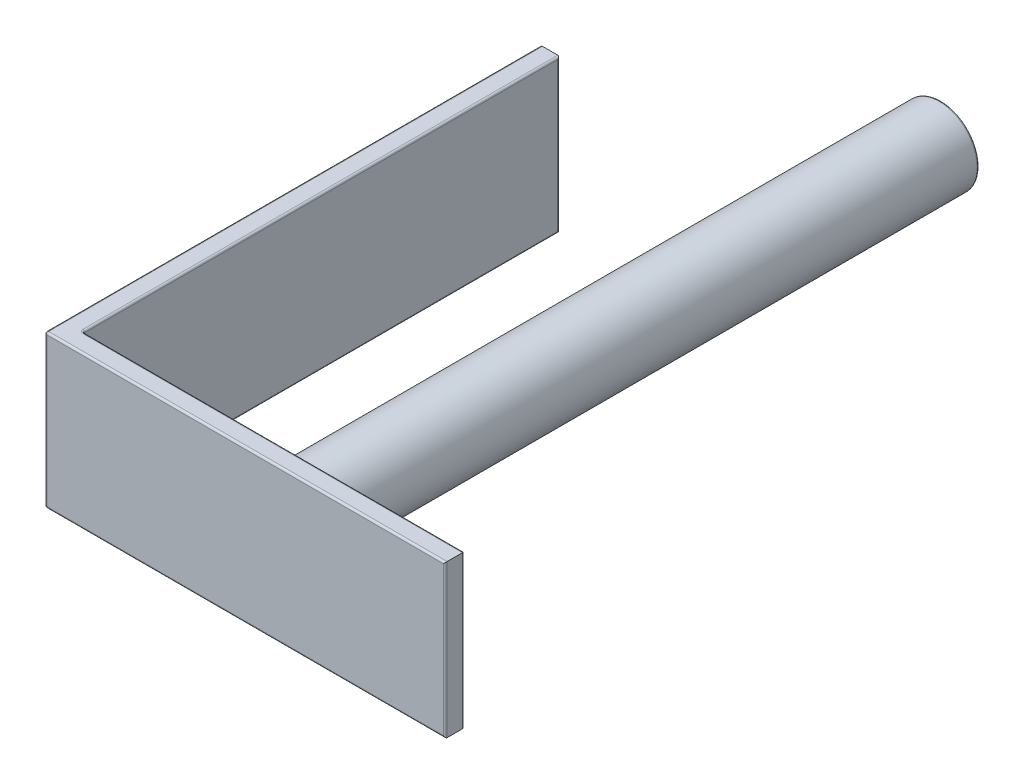
ISO-10303-21;
HEADER;
FILE_DESCRIPTION(('STEP AP214'),'2;1');
FILE_NAME('part.step','',(''),(''),'','','');
FILE_SCHEMA(('AUTOMOTIVE_DESIGN { 1 0 10303 214 1 1 1 1 }'));
ENDSEC;
DATA;
#1=APPLICATION_CONTEXT('core data for automotive mechanical design processes');
#2=APPLICATION_PROTOCOL_DEFINITION('international standard','automotive_design',2000,#1);
#3=PRODUCT_CONTEXT('',#1,'mechanical');
#4=PRODUCT('Part','Part','',(#3));
#5=PRODUCT_RELATED_PRODUCT_CATEGORY('part','',(#4));
#6=PRODUCT_DEFINITION_FORMATION('','',#4);
#7=PRODUCT_DEFINITION_CONTEXT('part definition',#1,'design');
#8=PRODUCT_DEFINITION('design','',#6,#7);
#9=PRODUCT_DEFINITION_SHAPE('','',#8);
#10=(LENGTH_UNIT() NAMED_UNIT(*) SI_UNIT(.MILLI.,.METRE.));
#11=(NAMED_UNIT(*) PLANE_ANGLE_UNIT() SI_UNIT($,.RADIAN.));
#12=(NAMED_UNIT(*) SI_UNIT($,.STERADIAN.) SOLID_ANGLE_UNIT());
#13=UNCERTAINTY_MEASURE_WITH_UNIT(LENGTH_MEASURE(1.E-05),#10,'distance_accuracy_value','');
#14=(GEOMETRIC_REPRESENTATION_CONTEXT(3) GLOBAL_UNCERTAINTY_ASSIGNED_CONTEXT((#13)) GLOBAL_UNIT_ASSIGNED_CONTEXT((#10,
#11,#12)) REPRESENTATION_CONTEXT('',''));
#15=CARTESIAN_POINT('',(0.,0.,0.));
#16=DIRECTION('',(0.,0.,1.));
#17=DIRECTION('',(1.,0.,0.));
#18=AXIS2_PLACEMENT_3D('',#15,#16,#17);
#19=CARTESIAN_POINT('',(0.,0.,-889.));
#20=DIRECTION('',(0.,0.,1.));
#21=DIRECTION('',(1.,0.,0.));
#22=AXIS2_PLACEMENT_3D('',#19,#20,#21);
#23=CYLINDRICAL_SURFACE('',#22,50.8);
#24=CARTESIAN_POINT('',(0.,0.,-2.53999999999999));
#25=DIRECTION('',(0.,0.,1.));
#26=DIRECTION('',(1.,0.,0.));
#27=AXIS2_PLACEMENT_3D('',#24,#25,#26);
#28=CIRCLE('',#27,50.8);
#29=CARTESIAN_POINT('',(50.8,0.,-2.54));
#30=VERTEX_POINT('',#29);
#31=EDGE_CURVE('E244',#30,#30,#28,.F.);
#32=ORIENTED_EDGE('',*,*,#31,.T.);
#33=EDGE_LOOP('',(#32));
#34=FACE_BOUND('',#33,.T.);
#35=CARTESIAN_POINT('',(0.,0.,-886.46));
#36=DIRECTION('',(0.,0.,1.));
#37=DIRECTION('',(1.,0.,0.));
#38=AXIS2_PLACEMENT_3D('',#35,#36,#37);
#39=CIRCLE('',#38,50.8);
#40=CARTESIAN_POINT('',(50.8,0.,-886.46));
#41=VERTEX_POINT('',#40);
#42=EDGE_CURVE('E241',#41,#41,#39,.T.);
#43=ORIENTED_EDGE('',*,*,#42,.T.);
#44=EDGE_LOOP('',(#43));
#45=FACE_BOUND('',#44,.T.);
#46=ADVANCED_FACE('F39',(#34,#45),#23,.T.);
#47=CARTESIAN_POINT('',(0.,0.,-889.));
#48=DIRECTION('',(0.,0.,1.));
#49=DIRECTION('',(1.,0.,0.));
#50=AXIS2_PLACEMENT_3D('',#47,#48,#49);
#51=PLANE('',#50);
#52=CARTESIAN_POINT('',(0.,0.,-889.));
#53=DIRECTION('',(0.,0.,1.));
#54=DIRECTION('',(1.,0.,0.));
#55=AXIS2_PLACEMENT_3D('',#52,#53,#54);
#56=CIRCLE('',#55,48.26);
#57=CARTESIAN_POINT('',(48.26,0.,-889.));
#58=VERTEX_POINT('',#57);
#59=EDGE_CURVE('E247',#58,#58,#56,.F.);
#60=ORIENTED_EDGE('',*,*,#59,.T.);
#61=EDGE_LOOP('',(#60));
#62=FACE_BOUND('',#61,.T.);
#63=ADVANCED_FACE('F347',(#62),#51,.F.);
#64=CARTESIAN_POINT('',(-254.,101.6,0.));
#65=DIRECTION('',(-1.,0.,0.));
#66=DIRECTION('',(0.,0.,1.));
#67=AXIS2_PLACEMENT_3D('',#64,#65,#66);
#68=PLANE('',#67);
#69=DIRECTION('',(0.,-1.,0.));
#70=VECTOR('',#69,1.);
#71=CARTESIAN_POINT('',(-254.,-101.6,-2.53999999999995));
#72=LINE('',#71,#70);
#73=CARTESIAN_POINT('',(-254.,99.06,-2.53999999999995));
#74=VERTEX_POINT('',#73);
#75=CARTESIAN_POINT('',(-254.,-99.06,-2.53999999999995));
#76=VERTEX_POINT('',#75);
#77=EDGE_CURVE('E166',#74,#76,#72,.T.);
#78=ORIENTED_EDGE('',*,*,#77,.T.);
#79=DIRECTION('',(0.,0.,-1.));
#80=VECTOR('',#79,1.);
#81=CARTESIAN_POINT('',(-254.,-99.06,-635.));
#82=LINE('',#81,#80);
#83=CARTESIAN_POINT('',(-254.,-99.06,-632.46));
#84=VERTEX_POINT('',#83);
#85=EDGE_CURVE('E64',#76,#84,#82,.T.);
#86=ORIENTED_EDGE('',*,*,#85,.T.);
#87=DIRECTION('',(0.,-1.,0.));
#88=VECTOR('',#87,1.);
#89=CARTESIAN_POINT('',(-254.,101.6,-632.46));
#90=LINE('',#89,#88);
#91=CARTESIAN_POINT('',(-254.,99.06,-632.46));
#92=VERTEX_POINT('',#91);
#93=EDGE_CURVE('E252',#84,#92,#90,.F.);
#94=ORIENTED_EDGE('',*,*,#93,.T.);
#95=DIRECTION('',(0.,0.,-1.));
#96=VECTOR('',#95,1.);
#97=CARTESIAN_POINT('',(-254.,99.06,0.));
#98=LINE('',#97,#96);
#99=EDGE_CURVE('E250',#92,#74,#98,.F.);
#100=ORIENTED_EDGE('',*,*,#99,.T.);
#101=EDGE_LOOP('',(#78,#86,#94,#100));
#102=FACE_BOUND('',#101,.T.);
#103=ADVANCED_FACE('F353',(#102),#68,.F.);
#104=CARTESIAN_POINT('',(-279.4,101.6,-635.));
#105=DIRECTION('',(0.,0.,-1.));
#106=DIRECTION('',(-1.,0.,0.));
#107=AXIS2_PLACEMENT_3D('',#104,#105,#106);
#108=PLANE('',#107);
#109=DIRECTION('',(1.,0.,0.));
#110=VECTOR('',#109,1.);
#111=CARTESIAN_POINT('',(-279.4,-101.6,-635.));
#112=LINE('',#111,#110);
#113=CARTESIAN_POINT('',(-276.86,-101.6,-635.));
#114=VERTEX_POINT('',#113);
#115=CARTESIAN_POINT('',(-256.54,-101.6,-635.));
#116=VERTEX_POINT('',#115);
#117=EDGE_CURVE('E271',#114,#116,#112,.T.);
#118=ORIENTED_EDGE('',*,*,#117,.F.);
#119=DIRECTION('',(0.,-1.,0.));
#120=VECTOR('',#119,1.);
#121=CARTESIAN_POINT('',(-276.86,101.6,-635.));
#122=LINE('',#121,#120);
#123=CARTESIAN_POINT('',(-276.86,101.6,-635.));
#124=VERTEX_POINT('',#123);
#125=EDGE_CURVE('E11',#114,#124,#122,.F.);
#126=ORIENTED_EDGE('',*,*,#125,.T.);
#127=DIRECTION('',(1.,0.,0.));
#128=VECTOR('',#127,1.);
#129=CARTESIAN_POINT('',(-279.4,101.6,-635.));
#130=LINE('',#129,#128);
#131=CARTESIAN_POINT('',(-256.54,101.6,-635.));
#132=VERTEX_POINT('',#131);
#133=EDGE_CURVE('E188',#124,#132,#130,.T.);
#134=ORIENTED_EDGE('',*,*,#133,.T.);
#135=DIRECTION('',(0.,-1.,0.));
#136=VECTOR('',#135,1.);
#137=CARTESIAN_POINT('',(-256.54,-101.6,-635.));
#138=LINE('',#137,#136);
#139=EDGE_CURVE('E48',#132,#116,#138,.T.);
#140=ORIENTED_EDGE('',*,*,#139,.T.);
#141=EDGE_LOOP('',(#118,#126,#134,#140));
#142=FACE_BOUND('',#141,.T.);
#143=ADVANCED_FACE('F597',(#142),#108,.T.);
#144=CARTESIAN_POINT('',(-279.4,101.6,0.));
#145=DIRECTION('',(-1.,0.,0.));
#146=DIRECTION('',(0.,0.,1.));
#147=AXIS2_PLACEMENT_3D('',#144,#145,#146);
#148=PLANE('',#147);
#149=DIRECTION('',(0.,-1.,0.));
#150=VECTOR('',#149,1.);
#151=CARTESIAN_POINT('',(-279.4,101.6,22.8600000000001));
#152=LINE('',#151,#150);
#153=CARTESIAN_POINT('',(-279.4,-99.06,22.8600000000001));
#154=VERTEX_POINT('',#153);
#155=CARTESIAN_POINT('',(-279.4,99.06,22.8600000000001));
#156=VERTEX_POINT('',#155);
#157=EDGE_CURVE('E222',#154,#156,#152,.F.);
#158=ORIENTED_EDGE('',*,*,#157,.T.);
#159=DIRECTION('',(0.,0.,-1.));
#160=VECTOR('',#159,1.);
#161=CARTESIAN_POINT('',(-279.4,99.06,-635.));
#162=LINE('',#161,#160);
#163=CARTESIAN_POINT('',(-279.4,99.06,-632.46));
#164=VERTEX_POINT('',#163);
#165=EDGE_CURVE('E225',#156,#164,#162,.T.);
#166=ORIENTED_EDGE('',*,*,#165,.T.);
#167=DIRECTION('',(0.,-1.,0.));
#168=VECTOR('',#167,1.);
#169=CARTESIAN_POINT('',(-279.4,101.6,-632.46));
#170=LINE('',#169,#168);
#171=CARTESIAN_POINT('',(-279.4,-99.06,-632.46));
#172=VERTEX_POINT('',#171);
#173=EDGE_CURVE('E220',#164,#172,#170,.T.);
#174=ORIENTED_EDGE('',*,*,#173,.T.);
#175=DIRECTION('',(0.,0.,-1.));
#176=VECTOR('',#175,1.);
#177=CARTESIAN_POINT('',(-279.4,-99.06,0.));
#178=LINE('',#177,#176);
#179=EDGE_CURVE('E218',#172,#154,#178,.F.);
#180=ORIENTED_EDGE('',*,*,#179,.T.);
#181=EDGE_LOOP('',(#158,#166,#174,#180));
#182=FACE_BOUND('',#181,.T.);
#183=ADVANCED_FACE('F313',(#182),#148,.T.);
#184=CARTESIAN_POINT('',(254.,101.6,25.3999999999999));
#185=DIRECTION('',(0.,0.,1.));
#186=DIRECTION('',(1.,0.,0.));
#187=AXIS2_PLACEMENT_3D('',#184,#185,#186);
#188=PLANE('',#187);
#189=DIRECTION('',(-1.,0.,0.));
#190=VECTOR('',#189,1.);
#191=CARTESIAN_POINT('',(-279.4,99.06,25.4000000000001));
#192=LINE('',#191,#190);
#193=CARTESIAN_POINT('',(251.46,99.06,25.3999999999999));
#194=VERTEX_POINT('',#193);
#195=CARTESIAN_POINT('',(-276.86,99.06,25.4000000000001));
#196=VERTEX_POINT('',#195);
#197=EDGE_CURVE('E213',#194,#196,#192,.T.);
#198=ORIENTED_EDGE('',*,*,#197,.T.);
#199=DIRECTION('',(0.,-1.,0.));
#200=VECTOR('',#199,1.);
#201=CARTESIAN_POINT('',(-276.86,101.6,25.4000000000001));
#202=LINE('',#201,#200);
#203=CARTESIAN_POINT('',(-276.86,-99.06,25.4000000000001));
#204=VERTEX_POINT('',#203);
#205=EDGE_CURVE('E215',#196,#204,#202,.T.);
#206=ORIENTED_EDGE('',*,*,#205,.T.);
#207=DIRECTION('',(-1.,0.,0.));
#208=VECTOR('',#207,1.);
#209=CARTESIAN_POINT('',(254.,-99.06,25.3999999999999));
#210=LINE('',#209,#208);
#211=CARTESIAN_POINT('',(251.46,-99.06,25.3999999999999));
#212=VERTEX_POINT('',#211);
#213=EDGE_CURVE('E209',#204,#212,#210,.F.);
#214=ORIENTED_EDGE('',*,*,#213,.T.);
#215=DIRECTION('',(0.,-1.,0.));
#216=VECTOR('',#215,1.);
#217=CARTESIAN_POINT('',(251.46,101.6,25.3999999999999));
#218=LINE('',#217,#216);
#219=EDGE_CURVE('E211',#212,#194,#218,.F.);
#220=ORIENTED_EDGE('',*,*,#219,.T.);
#221=EDGE_LOOP('',(#198,#206,#214,#220));
#222=FACE_BOUND('',#221,.T.);
#223=ADVANCED_FACE('F331',(#222),#188,.T.);
#224=CARTESIAN_POINT('',(254.,101.6,-1.05665963145283E-13));
#225=DIRECTION('',(1.,0.,0.));
#226=DIRECTION('',(0.,0.,-1.));
#227=AXIS2_PLACEMENT_3D('',#224,#225,#226);
#228=PLANE('',#227);
#229=DIRECTION('',(0.,0.,1.));
#230=VECTOR('',#229,1.);
#231=CARTESIAN_POINT('',(254.,101.6,-1.05665963145283E-13));
#232=LINE('',#231,#230);
#233=CARTESIAN_POINT('',(254.,101.6,2.53999999999989));
#234=VERTEX_POINT('',#233);
#235=CARTESIAN_POINT('',(254.,101.6,22.8599999999999));
#236=VERTEX_POINT('',#235);
#237=EDGE_CURVE('E184',#234,#236,#232,.T.);
#238=ORIENTED_EDGE('',*,*,#237,.T.);
#239=DIRECTION('',(0.,-1.,0.));
#240=VECTOR('',#239,1.);
#241=CARTESIAN_POINT('',(254.,101.6,22.8599999999999));
#242=LINE('',#241,#240);
#243=CARTESIAN_POINT('',(254.,-101.6,22.8599999999999));
#244=VERTEX_POINT('',#243);
#245=EDGE_CURVE('E239',#236,#244,#242,.T.);
#246=ORIENTED_EDGE('',*,*,#245,.T.);
#247=DIRECTION('',(0.,0.,1.));
#248=VECTOR('',#247,1.);
#249=CARTESIAN_POINT('',(254.,-101.6,-1.05665963145283E-13));
#250=LINE('',#249,#248);
#251=CARTESIAN_POINT('',(254.,-101.6,2.5399999999999));
#252=VERTEX_POINT('',#251);
#253=EDGE_CURVE('E191',#252,#244,#250,.T.);
#254=ORIENTED_EDGE('',*,*,#253,.F.);
#255=DIRECTION('',(0.,-1.,0.));
#256=VECTOR('',#255,1.);
#257=CARTESIAN_POINT('',(254.,101.6,2.5399999999999));
#258=LINE('',#257,#256);
#259=EDGE_CURVE('E237',#252,#234,#258,.F.);
#260=ORIENTED_EDGE('',*,*,#259,.T.);
#261=EDGE_LOOP('',(#238,#246,#254,#260));
#262=FACE_BOUND('',#261,.T.);
#263=ADVANCED_FACE('F570',(#262),#228,.T.);
#264=CARTESIAN_POINT('',(254.,101.6,-1.05665963145283E-13));
#265=DIRECTION('',(0.,0.,1.));
#266=DIRECTION('',(1.,0.,0.));
#267=AXIS2_PLACEMENT_3D('',#264,#265,#266);
#268=PLANE('',#267);
#269=CARTESIAN_POINT('',(0.,0.,0.));
#270=DIRECTION('',(0.,0.,1.));
#271=DIRECTION('',(1.,0.,0.));
#272=AXIS2_PLACEMENT_3D('',#269,#270,#271);
#273=CIRCLE('',#272,53.34);
#274=CARTESIAN_POINT('',(53.34,0.,0.));
#275=VERTEX_POINT('',#274);
#276=EDGE_CURVE('E195',#275,#275,#273,.T.);
#277=ORIENTED_EDGE('',*,*,#276,.T.);
#278=EDGE_LOOP('',(#277));
#279=FACE_BOUND('',#278,.T.);
#280=DIRECTION('',(0.,-1.,0.));
#281=VECTOR('',#280,1.);
#282=CARTESIAN_POINT('',(251.46,-101.6,-1.04888312427824E-13));
#283=LINE('',#282,#281);
#284=CARTESIAN_POINT('',(251.46,99.06,-1.04888312427824E-13));
#285=VERTEX_POINT('',#284);
#286=CARTESIAN_POINT('',(251.46,-99.06,-1.04888312427824E-13));
#287=VERTEX_POINT('',#286);
#288=EDGE_CURVE('E159',#285,#287,#283,.T.);
#289=ORIENTED_EDGE('',*,*,#288,.T.);
#290=DIRECTION('',(-1.,0.,0.));
#291=VECTOR('',#290,1.);
#292=CARTESIAN_POINT('',(-254.,-99.06,0.));
#293=LINE('',#292,#291);
#294=CARTESIAN_POINT('',(-251.46,-99.06,0.));
#295=VERTEX_POINT('',#294);
#296=EDGE_CURVE('E157',#287,#295,#293,.T.);
#297=ORIENTED_EDGE('',*,*,#296,.T.);
#298=DIRECTION('',(0.,-1.,0.));
#299=VECTOR('',#298,1.);
#300=CARTESIAN_POINT('',(-251.46,101.6,0.));
#301=LINE('',#300,#299);
#302=CARTESIAN_POINT('',(-251.46,99.06,0.));
#303=VERTEX_POINT('',#302);
#304=EDGE_CURVE('E150',#295,#303,#301,.F.);
#305=ORIENTED_EDGE('',*,*,#304,.T.);
#306=DIRECTION('',(-1.,0.,0.));
#307=VECTOR('',#306,1.);
#308=CARTESIAN_POINT('',(254.,99.06,-1.05665963145283E-13));
#309=LINE('',#308,#307);
#310=EDGE_CURVE('E154',#303,#285,#309,.F.);
#311=ORIENTED_EDGE('',*,*,#310,.T.);
#312=EDGE_LOOP('',(#289,#297,#305,#311));
#313=FACE_BOUND('',#312,.T.);
#314=ADVANCED_FACE('F152',(#279,#313),#268,.F.);
#315=CARTESIAN_POINT('',(0.,101.6,0.));
#316=DIRECTION('',(0.,-1.,0.));
#317=DIRECTION('',(-1.,0.,0.));
#318=AXIS2_PLACEMENT_3D('',#315,#316,#317);
#319=PLANE('',#318);
#320=DIRECTION('',(0.,0.,-1.));
#321=VECTOR('',#320,1.);
#322=CARTESIAN_POINT('',(-276.86,101.6,25.4000000000001));
#323=LINE('',#322,#321);
#324=CARTESIAN_POINT('',(-276.86,101.6,22.8600000000001));
#325=VERTEX_POINT('',#324);
#326=EDGE_CURVE('E232',#124,#325,#323,.F.);
#327=ORIENTED_EDGE('',*,*,#326,.T.);
#328=DIRECTION('',(-1.,0.,0.));
#329=VECTOR('',#328,1.);
#330=CARTESIAN_POINT('',(254.,101.6,22.8599999999999));
#331=LINE('',#330,#329);
#332=EDGE_CURVE('E234',#325,#236,#331,.F.);
#333=ORIENTED_EDGE('',*,*,#332,.T.);
#334=ORIENTED_EDGE('',*,*,#237,.F.);
#335=DIRECTION('',(-1.,0.,0.));
#336=VECTOR('',#335,1.);
#337=CARTESIAN_POINT('',(0.,101.6,2.53999999999997));
#338=LINE('',#337,#336);
#339=CARTESIAN_POINT('',(-251.46,101.6,2.54000000000005));
#340=VERTEX_POINT('',#339);
#341=EDGE_CURVE('E228',#234,#340,#338,.T.);
#342=ORIENTED_EDGE('',*,*,#341,.T.);
#343=CARTESIAN_POINT('',(-251.46,101.6,-2.53999999999995));
#344=DIRECTION('',(0.,-1.,0.));
#345=DIRECTION('',(0.,0.,-1.));
#346=AXIS2_PLACEMENT_3D('',#343,#344,#345);
#347=CIRCLE('',#346,5.08);
#348=CARTESIAN_POINT('',(-256.54,101.6,-2.53999999999995));
#349=VERTEX_POINT('',#348);
#350=EDGE_CURVE('E175',#349,#340,#347,.F.);
#351=ORIENTED_EDGE('',*,*,#350,.F.);
#352=DIRECTION('',(0.,0.,-1.));
#353=VECTOR('',#352,1.);
#354=CARTESIAN_POINT('',(-256.54,101.6,0.));
#355=LINE('',#354,#353);
#356=EDGE_CURVE('E230',#349,#132,#355,.T.);
#357=ORIENTED_EDGE('',*,*,#356,.T.);
#358=ORIENTED_EDGE('',*,*,#133,.F.);
#359=EDGE_LOOP('',(#327,#333,#334,#342,#351,#357,#358));
#360=FACE_BOUND('',#359,.T.);
#361=ADVANCED_FACE('F551',(#360),#319,.F.);
#362=CARTESIAN_POINT('',(0.,-101.6,0.));
#363=DIRECTION('',(0.,-1.,0.));
#364=DIRECTION('',(-1.,0.,0.));
#365=AXIS2_PLACEMENT_3D('',#362,#363,#364);
#366=PLANE('',#365);
#367=CARTESIAN_POINT('',(-251.46,-101.6,-2.53999999999995));
#368=DIRECTION('',(0.,-1.,0.));
#369=DIRECTION('',(0.,0.,-1.));
#370=AXIS2_PLACEMENT_3D('',#367,#368,#369);
#371=CIRCLE('',#370,5.08);
#372=CARTESIAN_POINT('',(-251.46,-101.6,2.54000000000005));
#373=VERTEX_POINT('',#372);
#374=CARTESIAN_POINT('',(-256.54,-101.6,-2.53999999999995));
#375=VERTEX_POINT('',#374);
#376=EDGE_CURVE('E202',#373,#375,#371,.T.);
#377=ORIENTED_EDGE('',*,*,#376,.F.);
#378=DIRECTION('',(-1.,0.,0.));
#379=VECTOR('',#378,1.);
#380=CARTESIAN_POINT('',(254.,-101.6,2.53999999999989));
#381=LINE('',#380,#379);
#382=EDGE_CURVE('E206',#373,#252,#381,.F.);
#383=ORIENTED_EDGE('',*,*,#382,.T.);
#384=ORIENTED_EDGE('',*,*,#253,.T.);
#385=DIRECTION('',(-1.,0.,0.));
#386=VECTOR('',#385,1.);
#387=CARTESIAN_POINT('',(0.,-101.6,22.86));
#388=LINE('',#387,#386);
#389=CARTESIAN_POINT('',(-276.86,-101.6,22.8600000000001));
#390=VERTEX_POINT('',#389);
#391=EDGE_CURVE('E200',#244,#390,#388,.T.);
#392=ORIENTED_EDGE('',*,*,#391,.T.);
#393=DIRECTION('',(0.,0.,-1.));
#394=VECTOR('',#393,1.);
#395=CARTESIAN_POINT('',(-276.86,-101.6,0.));
#396=LINE('',#395,#394);
#397=EDGE_CURVE('E198',#390,#114,#396,.T.);
#398=ORIENTED_EDGE('',*,*,#397,.T.);
#399=ORIENTED_EDGE('',*,*,#117,.T.);
#400=DIRECTION('',(0.,0.,-1.));
#401=VECTOR('',#400,1.);
#402=CARTESIAN_POINT('',(-256.54,-101.6,0.));
#403=LINE('',#402,#401);
#404=EDGE_CURVE('E204',#116,#375,#403,.F.);
#405=ORIENTED_EDGE('',*,*,#404,.T.);
#406=EDGE_LOOP('',(#377,#383,#384,#392,#398,#399,#405));
#407=FACE_BOUND('',#406,.T.);
#408=ADVANCED_FACE('F388',(#407),#366,.T.);
#409=CARTESIAN_POINT('',(-256.54,99.06,0.));
#410=DIRECTION('',(0.,0.,-1.));
#411=DIRECTION('',(-1.,0.,0.));
#412=AXIS2_PLACEMENT_3D('',#409,#410,#411);
#413=CYLINDRICAL_SURFACE('',#412,2.54);
#414=CARTESIAN_POINT('',(-256.54,99.06,-632.46));
#415=DIRECTION('',(0.,-0.707106781186547,-0.707106781186547));
#416=DIRECTION('',(0.,0.707106781186547,-0.707106781186547));
#417=AXIS2_PLACEMENT_3D('',#414,#415,#416);
#418=ELLIPSE('',#417,3.59210244842766,2.54);
#419=EDGE_CURVE('E178',#132,#92,#418,.T.);
#420=ORIENTED_EDGE('',*,*,#419,.F.);
#421=ORIENTED_EDGE('',*,*,#356,.F.);
#422=CARTESIAN_POINT('',(-256.54,99.06,-2.53999999999995));
#423=DIRECTION('',(0.,0.,1.));
#424=DIRECTION('',(1.,0.,0.));
#425=AXIS2_PLACEMENT_3D('',#422,#423,#424);
#426=CIRCLE('',#425,2.54);
#427=EDGE_CURVE('E269',#74,#349,#426,.T.);
#428=ORIENTED_EDGE('',*,*,#427,.F.);
#429=ORIENTED_EDGE('',*,*,#99,.F.);
#430=EDGE_LOOP('',(#420,#421,#428,#429));
#431=FACE_BOUND('',#430,.T.);
#432=ADVANCED_FACE('F385',(#431),#413,.T.);
#433=CARTESIAN_POINT('',(-251.46,99.06,-2.53999999999995));
#434=DIRECTION('',(0.,-1.,0.));
#435=DIRECTION('',(0.,0.,-1.));
#436=AXIS2_PLACEMENT_3D('',#433,#434,#435);
#437=TOROIDAL_SURFACE('',#436,5.08,2.54);
#438=ORIENTED_EDGE('',*,*,#427,.T.);
#439=ORIENTED_EDGE('',*,*,#350,.T.);
#440=CARTESIAN_POINT('',(-251.46,99.06,2.54000000000005));
#441=DIRECTION('',(-1.,0.,0.));
#442=DIRECTION('',(0.,0.,1.));
#443=AXIS2_PLACEMENT_3D('',#440,#441,#442);
#444=CIRCLE('',#443,2.54);
#445=EDGE_CURVE('E169',#303,#340,#444,.F.);
#446=ORIENTED_EDGE('',*,*,#445,.F.);
#447=CARTESIAN_POINT('',(-251.46,99.06,-2.53999999999995));
#448=DIRECTION('',(0.,-1.,0.));
#449=DIRECTION('',(0.,0.,-1.));
#450=AXIS2_PLACEMENT_3D('',#447,#448,#449);
#451=CIRCLE('',#450,2.54);
#452=EDGE_CURVE('E163',#74,#303,#451,.F.);
#453=ORIENTED_EDGE('',*,*,#452,.F.);
#454=EDGE_LOOP('',(#438,#439,#446,#453));
#455=FACE_BOUND('',#454,.T.);
#456=ADVANCED_FACE('F174',(#455),#437,.T.);
#457=CARTESIAN_POINT('',(-256.54,101.6,-632.46));
#458=DIRECTION('',(0.,1.,0.));
#459=DIRECTION('',(0.,0.,1.));
#460=AXIS2_PLACEMENT_3D('',#457,#458,#459);
#461=CYLINDRICAL_SURFACE('',#460,2.54);
#462=ORIENTED_EDGE('',*,*,#419,.T.);
#463=ORIENTED_EDGE('',*,*,#93,.F.);
#464=CARTESIAN_POINT('',(-256.54,-99.06,-632.46));
#465=DIRECTION('',(0.,-0.707106781186547,0.707106781186547));
#466=DIRECTION('',(0.,0.707106781186547,0.707106781186547));
#467=AXIS2_PLACEMENT_3D('',#464,#465,#466);
#468=ELLIPSE('',#467,3.59210244842766,2.54);
#469=EDGE_CURVE('E170',#116,#84,#468,.T.);
#470=ORIENTED_EDGE('',*,*,#469,.F.);
#471=ORIENTED_EDGE('',*,*,#139,.F.);
#472=EDGE_LOOP('',(#462,#463,#470,#471));
#473=FACE_BOUND('',#472,.T.);
#474=ADVANCED_FACE('F379',(#473),#461,.T.);
#475=CARTESIAN_POINT('',(0.,99.06,2.53999999999997));
#476=DIRECTION('',(-1.,0.,0.));
#477=DIRECTION('',(0.,0.,1.));
#478=AXIS2_PLACEMENT_3D('',#475,#476,#477);
#479=CYLINDRICAL_SURFACE('',#478,2.54);
#480=ORIENTED_EDGE('',*,*,#445,.T.);
#481=ORIENTED_EDGE('',*,*,#341,.F.);
#482=CARTESIAN_POINT('',(251.46,99.06,2.53999999999989));
#483=DIRECTION('',(-0.707106781186547,0.707106781186547,0.));
#484=DIRECTION('',(-0.707106781186547,-0.707106781186547,0.));
#485=AXIS2_PLACEMENT_3D('',#482,#483,#484);
#486=ELLIPSE('',#485,3.59210244842766,2.54);
#487=EDGE_CURVE('E182',#285,#234,#486,.F.);
#488=ORIENTED_EDGE('',*,*,#487,.F.);
#489=ORIENTED_EDGE('',*,*,#310,.F.);
#490=EDGE_LOOP('',(#480,#481,#488,#489));
#491=FACE_BOUND('',#490,.T.);
#492=ADVANCED_FACE('F180',(#491),#479,.T.);
#493=CARTESIAN_POINT('',(-251.46,101.6,-2.53999999999995));
#494=DIRECTION('',(0.,1.,0.));
#495=DIRECTION('',(0.,0.,1.));
#496=AXIS2_PLACEMENT_3D('',#493,#494,#495);
#497=CYLINDRICAL_SURFACE('',#496,2.54);
#498=ORIENTED_EDGE('',*,*,#452,.T.);
#499=ORIENTED_EDGE('',*,*,#304,.F.);
#500=CARTESIAN_POINT('',(-251.46,-99.06,-2.53999999999995));
#501=DIRECTION('',(0.,-1.,0.));
#502=DIRECTION('',(0.,0.,-1.));
#503=AXIS2_PLACEMENT_3D('',#500,#501,#502);
#504=CIRCLE('',#503,2.54);
#505=EDGE_CURVE('E262',#76,#295,#504,.F.);
#506=ORIENTED_EDGE('',*,*,#505,.F.);
#507=ORIENTED_EDGE('',*,*,#77,.F.);
#508=EDGE_LOOP('',(#498,#499,#506,#507));
#509=FACE_BOUND('',#508,.T.);
#510=ADVANCED_FACE('F165',(#509),#497,.F.);
#511=CARTESIAN_POINT('',(-256.54,-99.06,0.));
#512=DIRECTION('',(0.,0.,1.));
#513=DIRECTION('',(1.,0.,0.));
#514=AXIS2_PLACEMENT_3D('',#511,#512,#513);
#515=CYLINDRICAL_SURFACE('',#514,2.54);
#516=ORIENTED_EDGE('',*,*,#469,.T.);
#517=ORIENTED_EDGE('',*,*,#85,.F.);
#518=CARTESIAN_POINT('',(-256.54,-99.06,-2.53999999999995));
#519=DIRECTION('',(0.,0.,1.));
#520=DIRECTION('',(1.,0.,0.));
#521=AXIS2_PLACEMENT_3D('',#518,#519,#520);
#522=CIRCLE('',#521,2.54);
#523=EDGE_CURVE('E56',#375,#76,#522,.T.);
#524=ORIENTED_EDGE('',*,*,#523,.F.);
#525=ORIENTED_EDGE('',*,*,#404,.F.);
#526=EDGE_LOOP('',(#516,#517,#524,#525));
#527=FACE_BOUND('',#526,.T.);
#528=ADVANCED_FACE('F370',(#527),#515,.T.);
#529=CARTESIAN_POINT('',(251.46,101.6,2.5399999999999));
#530=DIRECTION('',(0.,1.,0.));
#531=DIRECTION('',(0.,0.,1.));
#532=AXIS2_PLACEMENT_3D('',#529,#530,#531);
#533=CYLINDRICAL_SURFACE('',#532,2.54);
#534=ORIENTED_EDGE('',*,*,#487,.T.);
#535=ORIENTED_EDGE('',*,*,#259,.F.);
#536=CARTESIAN_POINT('',(251.46,-99.06,2.5399999999999));
#537=DIRECTION('',(0.707106781186547,0.707106781186547,0.));
#538=DIRECTION('',(-0.707106781186547,0.707106781186547,0.));
#539=AXIS2_PLACEMENT_3D('',#536,#537,#538);
#540=ELLIPSE('',#539,3.59210244842766,2.54);
#541=EDGE_CURVE('E259',#287,#252,#540,.F.);
#542=ORIENTED_EDGE('',*,*,#541,.F.);
#543=ORIENTED_EDGE('',*,*,#288,.F.);
#544=EDGE_LOOP('',(#534,#535,#542,#543));
#545=FACE_BOUND('',#544,.T.);
#546=ADVANCED_FACE('F367',(#545),#533,.T.);
#547=CARTESIAN_POINT('',(-251.46,-99.06,-2.53999999999995));
#548=DIRECTION('',(0.,-1.,0.));
#549=DIRECTION('',(0.,0.,-1.));
#550=AXIS2_PLACEMENT_3D('',#547,#548,#549);
#551=TOROIDAL_SURFACE('',#550,5.08,2.54);
#552=ORIENTED_EDGE('',*,*,#523,.T.);
#553=ORIENTED_EDGE('',*,*,#505,.T.);
#554=CARTESIAN_POINT('',(-251.46,-99.06,2.54000000000005));
#555=DIRECTION('',(-1.,0.,0.));
#556=DIRECTION('',(0.,0.,1.));
#557=AXIS2_PLACEMENT_3D('',#554,#555,#556);
#558=CIRCLE('',#557,2.54);
#559=EDGE_CURVE('E257',#373,#295,#558,.F.);
#560=ORIENTED_EDGE('',*,*,#559,.F.);
#561=ORIENTED_EDGE('',*,*,#376,.T.);
#562=EDGE_LOOP('',(#552,#553,#560,#561));
#563=FACE_BOUND('',#562,.T.);
#564=ADVANCED_FACE('F363',(#563),#551,.T.);
#565=CARTESIAN_POINT('',(254.,-99.06,2.53999999999989));
#566=DIRECTION('',(1.,0.,0.));
#567=DIRECTION('',(0.,0.,-1.));
#568=AXIS2_PLACEMENT_3D('',#565,#566,#567);
#569=CYLINDRICAL_SURFACE('',#568,2.54);
#570=ORIENTED_EDGE('',*,*,#541,.T.);
#571=ORIENTED_EDGE('',*,*,#382,.F.);
#572=ORIENTED_EDGE('',*,*,#559,.T.);
#573=ORIENTED_EDGE('',*,*,#296,.F.);
#574=EDGE_LOOP('',(#570,#571,#572,#573));
#575=FACE_BOUND('',#574,.T.);
#576=ADVANCED_FACE('F359',(#575),#569,.T.);
#577=CARTESIAN_POINT('',(251.46,101.6,22.8599999999999));
#578=DIRECTION('',(0.,-1.,0.));
#579=DIRECTION('',(0.,0.,-1.));
#580=AXIS2_PLACEMENT_3D('',#577,#578,#579);
#581=CYLINDRICAL_SURFACE('',#580,2.54);
#582=CARTESIAN_POINT('',(251.46,-99.06,22.8599999999999));
#583=DIRECTION('',(-0.707106781186547,-0.707106781186547,0.));
#584=DIRECTION('',(-0.707106781186547,0.707106781186547,0.));
#585=AXIS2_PLACEMENT_3D('',#582,#583,#584);
#586=ELLIPSE('',#585,3.59210244842766,2.54);
#587=EDGE_CURVE('E291',#244,#212,#586,.T.);
#588=ORIENTED_EDGE('',*,*,#587,.F.);
#589=ORIENTED_EDGE('',*,*,#245,.F.);
#590=CARTESIAN_POINT('',(251.46,99.06,22.8599999999999));
#591=DIRECTION('',(0.707106781186547,-0.707106781186547,0.));
#592=DIRECTION('',(-0.707106781186547,-0.707106781186547,0.));
#593=AXIS2_PLACEMENT_3D('',#590,#591,#592);
#594=ELLIPSE('',#593,3.59210244842766,2.54);
#595=EDGE_CURVE('E293',#194,#236,#594,.F.);
#596=ORIENTED_EDGE('',*,*,#595,.F.);
#597=ORIENTED_EDGE('',*,*,#219,.F.);
#598=EDGE_LOOP('',(#588,#589,#596,#597));
#599=FACE_BOUND('',#598,.T.);
#600=ADVANCED_FACE('F362',(#599),#581,.T.);
#601=CARTESIAN_POINT('',(-276.86,101.6,-632.46));
#602=DIRECTION('',(0.,-1.,0.));
#603=DIRECTION('',(0.,0.,-1.));
#604=AXIS2_PLACEMENT_3D('',#601,#602,#603);
#605=CYLINDRICAL_SURFACE('',#604,2.54);
#606=CARTESIAN_POINT('',(-276.86,-99.06,-632.46));
#607=DIRECTION('',(0.,0.707106781186547,-0.707106781186547));
#608=DIRECTION('',(0.,-0.707106781186547,-0.707106781186547));
#609=AXIS2_PLACEMENT_3D('',#606,#607,#608);
#610=ELLIPSE('',#609,3.59210244842766,2.54);
#611=EDGE_CURVE('E288',#172,#114,#610,.F.);
#612=ORIENTED_EDGE('',*,*,#611,.F.);
#613=ORIENTED_EDGE('',*,*,#173,.F.);
#614=CARTESIAN_POINT('',(-276.86,99.06,-632.46));
#615=DIRECTION('',(0.,0.707106781186547,0.707106781186547));
#616=DIRECTION('',(0.,-0.707106781186547,0.707106781186547));
#617=AXIS2_PLACEMENT_3D('',#614,#615,#616);
#618=ELLIPSE('',#617,3.59210244842766,2.54);
#619=EDGE_CURVE('E43',#124,#164,#618,.T.);
#620=ORIENTED_EDGE('',*,*,#619,.F.);
#621=ORIENTED_EDGE('',*,*,#125,.F.);
#622=EDGE_LOOP('',(#612,#613,#620,#621));
#623=FACE_BOUND('',#622,.T.);
#624=ADVANCED_FACE('F310',(#623),#605,.T.);
#625=CARTESIAN_POINT('',(-276.86,99.06,0.));
#626=DIRECTION('',(0.,0.,1.));
#627=DIRECTION('',(1.,0.,0.));
#628=AXIS2_PLACEMENT_3D('',#625,#626,#627);
#629=CYLINDRICAL_SURFACE('',#628,2.54);
#630=ORIENTED_EDGE('',*,*,#619,.T.);
#631=ORIENTED_EDGE('',*,*,#165,.F.);
#632=CARTESIAN_POINT('',(-276.86,99.06,22.8600000000001));
#633=DIRECTION('',(0.,0.,1.));
#634=DIRECTION('',(1.,0.,0.));
#635=AXIS2_PLACEMENT_3D('',#632,#633,#634);
#636=CIRCLE('',#635,2.54);
#637=EDGE_CURVE('E285',#325,#156,#636,.T.);
#638=ORIENTED_EDGE('',*,*,#637,.F.);
#639=ORIENTED_EDGE('',*,*,#326,.F.);
#640=EDGE_LOOP('',(#630,#631,#638,#639));
#641=FACE_BOUND('',#640,.T.);
#642=ADVANCED_FACE('F304',(#641),#629,.T.);
#643=CARTESIAN_POINT('',(254.,99.06,22.8599999999999));
#644=DIRECTION('',(1.,0.,0.));
#645=DIRECTION('',(0.,0.,-1.));
#646=AXIS2_PLACEMENT_3D('',#643,#644,#645);
#647=CYLINDRICAL_SURFACE('',#646,2.54);
#648=ORIENTED_EDGE('',*,*,#595,.T.);
#649=ORIENTED_EDGE('',*,*,#332,.F.);
#650=CARTESIAN_POINT('',(-276.86,99.06,22.8600000000001));
#651=DIRECTION('',(-1.,0.,0.));
#652=DIRECTION('',(0.,0.,1.));
#653=AXIS2_PLACEMENT_3D('',#650,#651,#652);
#654=CIRCLE('',#653,2.54);
#655=EDGE_CURVE('E282',#196,#325,#654,.T.);
#656=ORIENTED_EDGE('',*,*,#655,.F.);
#657=ORIENTED_EDGE('',*,*,#197,.F.);
#658=EDGE_LOOP('',(#648,#649,#656,#657));
#659=FACE_BOUND('',#658,.T.);
#660=ADVANCED_FACE('F333',(#659),#647,.T.);
#661=CARTESIAN_POINT('',(0.,-99.06,22.86));
#662=DIRECTION('',(-1.,0.,0.));
#663=DIRECTION('',(0.,0.,1.));
#664=AXIS2_PLACEMENT_3D('',#661,#662,#663);
#665=CYLINDRICAL_SURFACE('',#664,2.54);
#666=ORIENTED_EDGE('',*,*,#587,.T.);
#667=ORIENTED_EDGE('',*,*,#213,.F.);
#668=CARTESIAN_POINT('',(-276.86,-99.06,22.8600000000001));
#669=DIRECTION('',(-1.,0.,0.));
#670=DIRECTION('',(0.,0.,1.));
#671=AXIS2_PLACEMENT_3D('',#668,#669,#670);
#672=CIRCLE('',#671,2.54);
#673=EDGE_CURVE('E279',#390,#204,#672,.T.);
#674=ORIENTED_EDGE('',*,*,#673,.F.);
#675=ORIENTED_EDGE('',*,*,#391,.F.);
#676=EDGE_LOOP('',(#666,#667,#674,#675));
#677=FACE_BOUND('',#676,.T.);
#678=ADVANCED_FACE('F327',(#677),#665,.T.);
#679=CARTESIAN_POINT('',(-276.86,-99.06,0.));
#680=DIRECTION('',(0.,0.,-1.));
#681=DIRECTION('',(-1.,0.,0.));
#682=AXIS2_PLACEMENT_3D('',#679,#680,#681);
#683=CYLINDRICAL_SURFACE('',#682,2.54);
#684=ORIENTED_EDGE('',*,*,#611,.T.);
#685=ORIENTED_EDGE('',*,*,#397,.F.);
#686=CARTESIAN_POINT('',(-276.86,-99.06,22.8600000000001));
#687=DIRECTION('',(0.,0.,1.));
#688=DIRECTION('',(1.,0.,0.));
#689=AXIS2_PLACEMENT_3D('',#686,#687,#688);
#690=CIRCLE('',#689,2.54);
#691=EDGE_CURVE('E276',#154,#390,#690,.T.);
#692=ORIENTED_EDGE('',*,*,#691,.F.);
#693=ORIENTED_EDGE('',*,*,#179,.F.);
#694=EDGE_LOOP('',(#684,#685,#692,#693));
#695=FACE_BOUND('',#694,.T.);
#696=ADVANCED_FACE('F337',(#695),#683,.T.);
#697=CARTESIAN_POINT('',(-276.86,99.06,22.8600000000001));
#698=DIRECTION('',(0.,1.,0.));
#699=DIRECTION('',(0.,0.,1.));
#700=AXIS2_PLACEMENT_3D('',#697,#698,#699);
#701=SPHERICAL_SURFACE('',#700,2.54);
#702=ORIENTED_EDGE('',*,*,#655,.T.);
#703=ORIENTED_EDGE('',*,*,#637,.T.);
#704=CARTESIAN_POINT('',(-276.86,99.06,22.8600000000001));
#705=DIRECTION('',(0.,1.,0.));
#706=DIRECTION('',(0.,0.,1.));
#707=AXIS2_PLACEMENT_3D('',#704,#705,#706);
#708=CIRCLE('',#707,2.54);
#709=EDGE_CURVE('E274',#196,#156,#708,.F.);
#710=ORIENTED_EDGE('',*,*,#709,.F.);
#711=EDGE_LOOP('',(#702,#703,#710));
#712=FACE_BOUND('',#711,.T.);
#713=ADVANCED_FACE('F335',(#712),#701,.T.);
#714=CARTESIAN_POINT('',(-276.86,-99.06,22.8600000000001));
#715=DIRECTION('',(0.,-1.,0.));
#716=DIRECTION('',(0.,0.,-1.));
#717=AXIS2_PLACEMENT_3D('',#714,#715,#716);
#718=SPHERICAL_SURFACE('',#717,2.54);
#719=ORIENTED_EDGE('',*,*,#691,.T.);
#720=ORIENTED_EDGE('',*,*,#673,.T.);
#721=CARTESIAN_POINT('',(-276.86,-99.06,22.8600000000001));
#722=DIRECTION('',(0.,-1.,0.));
#723=DIRECTION('',(0.,0.,-1.));
#724=AXIS2_PLACEMENT_3D('',#721,#722,#723);
#725=CIRCLE('',#724,2.54);
#726=EDGE_CURVE('E272',#154,#204,#725,.F.);
#727=ORIENTED_EDGE('',*,*,#726,.F.);
#728=EDGE_LOOP('',(#719,#720,#727));
#729=FACE_BOUND('',#728,.T.);
#730=ADVANCED_FACE('F322',(#729),#718,.T.);
#731=CARTESIAN_POINT('',(-276.86,101.6,22.8600000000001));
#732=DIRECTION('',(0.,-1.,0.));
#733=DIRECTION('',(0.,0.,-1.));
#734=AXIS2_PLACEMENT_3D('',#731,#732,#733);
#735=CYLINDRICAL_SURFACE('',#734,2.54);
#736=ORIENTED_EDGE('',*,*,#709,.T.);
#737=ORIENTED_EDGE('',*,*,#157,.F.);
#738=ORIENTED_EDGE('',*,*,#726,.T.);
#739=ORIENTED_EDGE('',*,*,#205,.F.);
#740=EDGE_LOOP('',(#736,#737,#738,#739));
#741=FACE_BOUND('',#740,.T.);
#742=ADVANCED_FACE('F318',(#741),#735,.T.);
#743=CARTESIAN_POINT('',(0.,0.,-2.53999999999999));
#744=DIRECTION('',(0.,0.,1.));
#745=DIRECTION('',(1.,0.,0.));
#746=AXIS2_PLACEMENT_3D('',#743,#744,#745);
#747=TOROIDAL_SURFACE('',#746,53.34,2.54);
#748=ORIENTED_EDGE('',*,*,#31,.F.);
#749=EDGE_LOOP('',(#748));
#750=FACE_BOUND('',#749,.T.);
#751=ORIENTED_EDGE('',*,*,#276,.F.);
#752=EDGE_LOOP('',(#751));
#753=FACE_BOUND('',#752,.T.);
#754=ADVANCED_FACE('F391',(#750,#753),#747,.F.);
#755=CARTESIAN_POINT('',(0.,0.,-886.46));
#756=DIRECTION('',(0.,0.,1.));
#757=DIRECTION('',(1.,0.,0.));
#758=AXIS2_PLACEMENT_3D('',#755,#756,#757);
#759=TOROIDAL_SURFACE('',#758,48.26,2.54);
#760=ORIENTED_EDGE('',*,*,#59,.F.);
#761=EDGE_LOOP('',(#760));
#762=FACE_BOUND('',#761,.T.);
#763=ORIENTED_EDGE('',*,*,#42,.F.);
#764=EDGE_LOOP('',(#763));
#765=FACE_BOUND('',#764,.T.);
#766=ADVANCED_FACE('F41',(#762,#765),#759,.T.);
#767=CLOSED_SHELL('',(#46,#63,#103,#143,#183,#223,#263,#314,#361,#408,#432,#456,#474,#492,#510,
#528,#546,#564,#576,#600,#624,#642,#660,#678,#696,#713,#730,#742,#754,#766));
#768=MANIFOLD_SOLID_BREP('B2',#767);
#769=ADVANCED_BREP_SHAPE_REPRESENTATION('',(#18,#768),#14);
#770=SHAPE_DEFINITION_REPRESENTATION(#9,#769);
ENDSEC;
END-ISO-10303-21;
